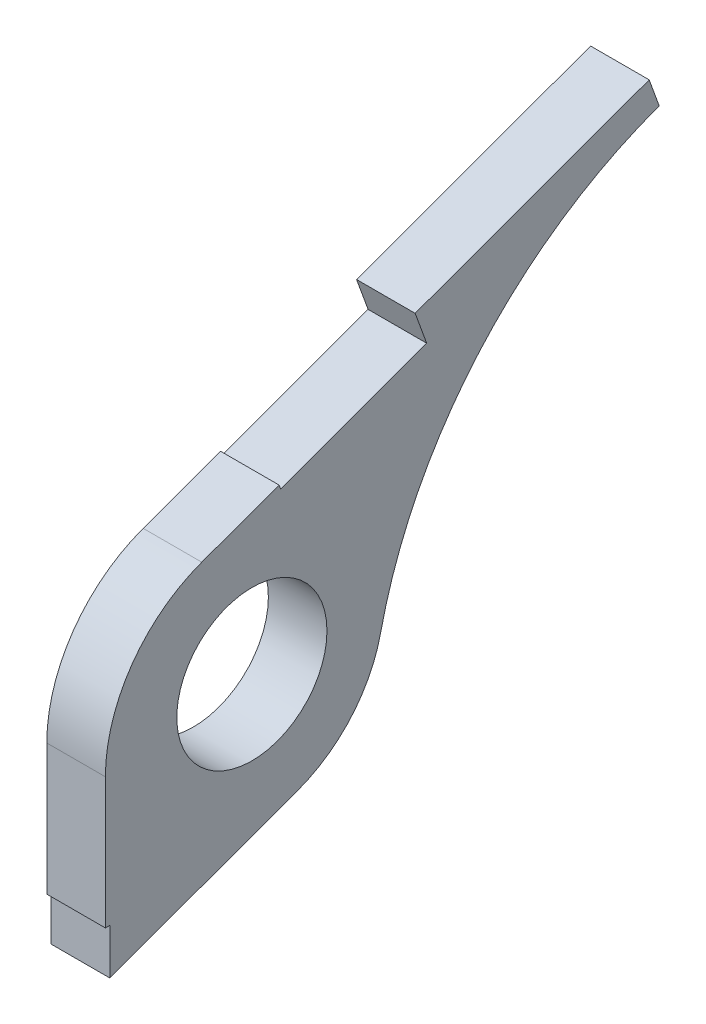
ISO-10303-21;
HEADER;
FILE_DESCRIPTION(('STEP AP214'),'2;1');
FILE_NAME('part.step','',(''),(''),'','','');
FILE_SCHEMA(('AUTOMOTIVE_DESIGN { 1 0 10303 214 1 1 1 1 }'));
ENDSEC;
DATA;
#1=APPLICATION_CONTEXT('core data for automotive mechanical design processes');
#2=APPLICATION_PROTOCOL_DEFINITION('international standard','automotive_design',2000,#1);
#3=PRODUCT_CONTEXT('',#1,'mechanical');
#4=PRODUCT('Part','Part','',(#3));
#5=PRODUCT_RELATED_PRODUCT_CATEGORY('part','',(#4));
#6=PRODUCT_DEFINITION_FORMATION('','',#4);
#7=PRODUCT_DEFINITION_CONTEXT('part definition',#1,'design');
#8=PRODUCT_DEFINITION('design','',#6,#7);
#9=PRODUCT_DEFINITION_SHAPE('','',#8);
#10=(LENGTH_UNIT() NAMED_UNIT(*) SI_UNIT(.MILLI.,.METRE.));
#11=(NAMED_UNIT(*) PLANE_ANGLE_UNIT() SI_UNIT($,.RADIAN.));
#12=(NAMED_UNIT(*) SI_UNIT($,.STERADIAN.) SOLID_ANGLE_UNIT());
#13=UNCERTAINTY_MEASURE_WITH_UNIT(LENGTH_MEASURE(1.E-05),#10,'distance_accuracy_value','');
#14=(GEOMETRIC_REPRESENTATION_CONTEXT(3) GLOBAL_UNCERTAINTY_ASSIGNED_CONTEXT((#13)) GLOBAL_UNIT_ASSIGNED_CONTEXT((#10,
#11,#12)) REPRESENTATION_CONTEXT('',''));
#15=CARTESIAN_POINT('',(0.,0.,0.));
#16=DIRECTION('',(0.,0.,1.));
#17=DIRECTION('',(1.,0.,0.));
#18=AXIS2_PLACEMENT_3D('',#15,#16,#17);
#19=CARTESIAN_POINT('',(240.599999999999,107.401908362402,262.395309409204));
#20=DIRECTION('',(0.,0.342020143325663,-0.939692620785911));
#21=DIRECTION('',(0.,0.939692620785911,0.342020143325663));
#22=AXIS2_PLACEMENT_3D('',#19,#20,#21);
#23=PLANE('',#22);
#24=DIRECTION('',(0.,0.939692620785911,0.342020143325663));
#25=VECTOR('',#24,1.);
#26=CARTESIAN_POINT('',(236.599999999999,107.401908362402,262.395309409204));
#27=LINE('',#26,#25);
#28=CARTESIAN_POINT('',(236.599999999999,107.683816148638,262.497915452201));
#29=VERTEX_POINT('',#28);
#30=CARTESIAN_POINT('',(236.599999999999,109.563201390209,263.181955738853));
#31=VERTEX_POINT('',#30);
#32=EDGE_CURVE('E143',#29,#31,#27,.T.);
#33=ORIENTED_EDGE('',*,*,#32,.T.);
#34=DIRECTION('',(-1.,0.,0.));
#35=VECTOR('',#34,1.);
#36=CARTESIAN_POINT('',(240.599999999999,109.563201390209,263.181955738853));
#37=LINE('',#36,#35);
#38=CARTESIAN_POINT('',(240.599999999999,109.563201390209,263.181955738853));
#39=VERTEX_POINT('',#38);
#40=EDGE_CURVE('E130',#39,#31,#37,.T.);
#41=ORIENTED_EDGE('',*,*,#40,.F.);
#42=DIRECTION('',(0.,0.939692620785911,0.342020143325663));
#43=VECTOR('',#42,1.);
#44=CARTESIAN_POINT('',(240.599999999999,107.401908362402,262.395309409204));
#45=LINE('',#44,#43);
#46=CARTESIAN_POINT('',(240.599999999999,107.683816148638,262.497915452201));
#47=VERTEX_POINT('',#46);
#48=EDGE_CURVE('E140',#47,#39,#45,.T.);
#49=ORIENTED_EDGE('',*,*,#48,.F.);
#50=DIRECTION('',(-1.,0.,0.));
#51=VECTOR('',#50,1.);
#52=CARTESIAN_POINT('',(240.599999999999,107.683816148638,262.497915452201));
#53=LINE('',#52,#51);
#54=EDGE_CURVE('E171',#47,#29,#53,.T.);
#55=ORIENTED_EDGE('',*,*,#54,.T.);
#56=EDGE_LOOP('',(#33,#41,#49,#55));
#57=FACE_BOUND('',#56,.T.);
#58=ADVANCED_FACE('F35',(#57),#23,.T.);
#59=CARTESIAN_POINT('',(240.599999999999,101.587565925866,278.370083962564));
#60=DIRECTION('',(0.,-0.342020143325663,0.939692620785911));
#61=DIRECTION('',(0.,-0.939692620785911,-0.342020143325663));
#62=AXIS2_PLACEMENT_3D('',#59,#60,#61);
#63=PLANE('',#62);
#64=DIRECTION('',(0.,0.939692620785911,0.342020143325663));
#65=VECTOR('',#64,1.);
#66=CARTESIAN_POINT('',(240.599999999999,101.587565925866,278.370083962564));
#67=LINE('',#66,#65);
#68=CARTESIAN_POINT('',(240.599999999999,101.587565925866,278.370083962564));
#69=VERTEX_POINT('',#68);
#70=CARTESIAN_POINT('',(240.599999999999,103.748858953673,279.156730292213));
#71=VERTEX_POINT('',#70);
#72=EDGE_CURVE('E150',#69,#71,#67,.T.);
#73=ORIENTED_EDGE('',*,*,#72,.T.);
#74=DIRECTION('',(1.,0.,0.));
#75=VECTOR('',#74,1.);
#76=CARTESIAN_POINT('',(236.599999999999,103.748858953673,279.156730292213));
#77=LINE('',#76,#75);
#78=CARTESIAN_POINT('',(236.599999999999,103.748858953673,279.156730292213));
#79=VERTEX_POINT('',#78);
#80=EDGE_CURVE('E50',#79,#71,#77,.T.);
#81=ORIENTED_EDGE('',*,*,#80,.F.);
#82=DIRECTION('',(0.,0.939692620785911,0.342020143325663));
#83=VECTOR('',#82,1.);
#84=CARTESIAN_POINT('',(236.599999999999,101.587565925866,278.370083962564));
#85=LINE('',#84,#83);
#86=CARTESIAN_POINT('',(236.599999999999,101.587565925866,278.370083962564));
#87=VERTEX_POINT('',#86);
#88=EDGE_CURVE('E154',#87,#79,#85,.T.);
#89=ORIENTED_EDGE('',*,*,#88,.F.);
#90=DIRECTION('',(1.,0.,0.));
#91=VECTOR('',#90,1.);
#92=CARTESIAN_POINT('',(240.599999999999,101.587565925866,278.370083962564));
#93=LINE('',#92,#91);
#94=EDGE_CURVE('E157',#87,#69,#93,.T.);
#95=ORIENTED_EDGE('',*,*,#94,.T.);
#96=EDGE_LOOP('',(#73,#81,#89,#95));
#97=FACE_BOUND('',#96,.T.);
#98=ADVANCED_FACE('F261',(#97),#63,.T.);
#99=CARTESIAN_POINT('',(236.599999999999,79.4930375250604,252.237311152431));
#100=DIRECTION('',(1.,0.,0.));
#101=DIRECTION('',(0.,0.,-1.));
#102=AXIS2_PLACEMENT_3D('',#99,#100,#101);
#103=PLANE('',#102);
#104=CARTESIAN_POINT('',(236.599999999999,87.9866537043276,290.301184893806));
#105=DIRECTION('',(1.,0.,0.));
#106=DIRECTION('',(0.,0.,-1.));
#107=AXIS2_PLACEMENT_3D('',#104,#105,#106);
#108=CIRCLE('',#107,5.125);
#109=CARTESIAN_POINT('',(236.599999999999,87.9866537043276,285.176184893806));
#110=VERTEX_POINT('',#109);
#111=EDGE_CURVE('E198',#110,#110,#108,.T.);
#112=ORIENTED_EDGE('',*,*,#111,.T.);
#113=EDGE_LOOP('',(#112));
#114=FACE_BOUND('',#113,.T.);
#115=DIRECTION('',(0.,-0.342020143325664,0.93969262078591));
#116=VECTOR('',#115,1.);
#117=CARTESIAN_POINT('',(236.599999999999,109.563201390209,263.181955738853));
#118=LINE('',#117,#116);
#119=EDGE_CURVE('E144',#31,#79,#118,.T.);
#120=ORIENTED_EDGE('',*,*,#119,.F.);
#121=ORIENTED_EDGE('',*,*,#32,.F.);
#122=CARTESIAN_POINT('',(236.599999999999,79.4930375250604,252.237311152431));
#123=DIRECTION('',(-1.,0.,0.));
#124=DIRECTION('',(0.,0.,-1.));
#125=AXIS2_PLACEMENT_3D('',#122,#123,#124);
#126=CIRCLE('',#125,30.);
#127=CARTESIAN_POINT('',(236.599999999999,86.026588432189,281.517214030412));
#128=VERTEX_POINT('',#127);
#129=EDGE_CURVE('E190',#128,#29,#126,.T.);
#130=ORIENTED_EDGE('',*,*,#129,.F.);
#131=CARTESIAN_POINT('',(236.599999999999,87.9866537043276,290.301184893806));
#132=DIRECTION('',(1.,0.,0.));
#133=DIRECTION('',(0.,0.,-1.));
#134=AXIS2_PLACEMENT_3D('',#131,#132,#133);
#135=CIRCLE('',#134,9.);
#136=CARTESIAN_POINT('',(236.599999999999,79.5294201172552,287.223003603873));
#137=VERTEX_POINT('',#136);
#138=EDGE_CURVE('E185',#137,#128,#135,.T.);
#139=ORIENTED_EDGE('',*,*,#138,.F.);
#140=DIRECTION('',(0.,0.342020143325917,-0.939692620785818));
#141=VECTOR('',#140,1.);
#142=CARTESIAN_POINT('',(236.599999999999,74.7693514093784,300.301184893806));
#143=LINE('',#142,#141);
#144=CARTESIAN_POINT('',(236.599999999999,74.8785424796584,300.001184893806));
#145=VERTEX_POINT('',#144);
#146=EDGE_CURVE('E177',#145,#137,#143,.T.);
#147=ORIENTED_EDGE('',*,*,#146,.F.);
#148=DIRECTION('',(0.,-1.,0.));
#149=VECTOR('',#148,1.);
#150=CARTESIAN_POINT('',(236.599999999999,79.4930375250604,300.001184893806));
#151=LINE('',#150,#149);
#152=CARTESIAN_POINT('',(236.599999999999,77.9866537043276,300.001184893806));
#153=VERTEX_POINT('',#152);
#154=EDGE_CURVE('E167',#153,#145,#151,.T.);
#155=ORIENTED_EDGE('',*,*,#154,.F.);
#156=DIRECTION('',(0.,0.,1.));
#157=VECTOR('',#156,1.);
#158=CARTESIAN_POINT('',(236.599999999999,77.9866537043276,252.237311152431));
#159=LINE('',#158,#157);
#160=CARTESIAN_POINT('',(236.599999999999,77.9866537043276,300.301184893806));
#161=VERTEX_POINT('',#160);
#162=EDGE_CURVE('E201',#153,#161,#159,.T.);
#163=ORIENTED_EDGE('',*,*,#162,.T.);
#164=DIRECTION('',(0.,-1.,0.));
#165=VECTOR('',#164,1.);
#166=CARTESIAN_POINT('',(236.599999999999,86.9224759318517,300.301184893806));
#167=LINE('',#166,#165);
#168=CARTESIAN_POINT('',(236.599999999999,86.9224759318517,300.301184893806));
#169=VERTEX_POINT('',#168);
#170=EDGE_CURVE('E173',#169,#161,#167,.T.);
#171=ORIENTED_EDGE('',*,*,#170,.F.);
#172=CARTESIAN_POINT('',(236.599999999999,86.9224759318517,290.301184893806));
#173=DIRECTION('',(1.,0.,0.));
#174=DIRECTION('',(0.,0.,-1.));
#175=AXIS2_PLACEMENT_3D('',#172,#173,#174);
#176=CIRCLE('',#175,10.);
#177=CARTESIAN_POINT('',(236.599999999999,96.3194021397108,293.721386327063));
#178=VERTEX_POINT('',#177);
#179=EDGE_CURVE('E178',#178,#169,#176,.T.);
#180=ORIENTED_EDGE('',*,*,#179,.F.);
#181=DIRECTION('',(0.,-0.342020143325636,0.93969262078592));
#182=VECTOR('',#181,1.);
#183=CARTESIAN_POINT('',(236.599999999999,98.2402356721976,288.443939570023));
#184=LINE('',#183,#182);
#185=CARTESIAN_POINT('',(236.599999999999,98.2402356721976,288.443939570023));
#186=VERTEX_POINT('',#185);
#187=EDGE_CURVE('E189',#186,#178,#184,.T.);
#188=ORIENTED_EDGE('',*,*,#187,.F.);
#189=DIRECTION('',(0.,0.939692620785911,0.342020143325663));
#190=VECTOR('',#189,1.);
#191=CARTESIAN_POINT('',(236.599999999999,70.0494570486204,278.183335270253));
#192=LINE('',#191,#190);
#193=CARTESIAN_POINT('',(236.599999999999,97.9583278859618,288.341333527025));
#194=VERTEX_POINT('',#193);
#195=EDGE_CURVE('E253',#194,#186,#192,.T.);
#196=ORIENTED_EDGE('',*,*,#195,.F.);
#197=DIRECTION('',(0.,-0.342020143325663,0.939692620785911));
#198=VECTOR('',#197,1.);
#199=CARTESIAN_POINT('',(236.599999999999,107.401908362402,262.395309409204));
#200=LINE('',#199,#198);
#201=EDGE_CURVE('E149',#87,#194,#200,.T.);
#202=ORIENTED_EDGE('',*,*,#201,.F.);
#203=ORIENTED_EDGE('',*,*,#88,.T.);
#204=EDGE_LOOP('',(#120,#121,#130,#139,#147,#155,#163,#171,#180,#188,#196,#202,#203));
#205=FACE_BOUND('',#204,.T.);
#206=ADVANCED_FACE('F232',(#114,#205),#103,.F.);
#207=CARTESIAN_POINT('',(240.599999999999,79.4930375250604,252.237311152431));
#208=DIRECTION('',(1.,0.,0.));
#209=DIRECTION('',(0.,0.,-1.));
#210=AXIS2_PLACEMENT_3D('',#207,#208,#209);
#211=PLANE('',#210);
#212=CARTESIAN_POINT('',(240.599999999999,87.9866537043276,290.301184893806));
#213=DIRECTION('',(1.,0.,0.));
#214=DIRECTION('',(0.,0.,-1.));
#215=AXIS2_PLACEMENT_3D('',#212,#213,#214);
#216=CIRCLE('',#215,5.125);
#217=CARTESIAN_POINT('',(240.599999999999,87.9866537043276,285.176184893806));
#218=VERTEX_POINT('',#217);
#219=EDGE_CURVE('E184',#218,#218,#216,.T.);
#220=ORIENTED_EDGE('',*,*,#219,.F.);
#221=EDGE_LOOP('',(#220));
#222=FACE_BOUND('',#221,.T.);
#223=ORIENTED_EDGE('',*,*,#48,.T.);
#224=DIRECTION('',(0.,0.342020143325663,-0.93969262078591));
#225=VECTOR('',#224,1.);
#226=CARTESIAN_POINT('',(240.599999999999,103.748858953673,279.156730292213));
#227=LINE('',#226,#225);
#228=EDGE_CURVE('E127',#71,#39,#227,.T.);
#229=ORIENTED_EDGE('',*,*,#228,.F.);
#230=ORIENTED_EDGE('',*,*,#72,.F.);
#231=DIRECTION('',(0.,-0.342020143325663,0.939692620785911));
#232=VECTOR('',#231,1.);
#233=CARTESIAN_POINT('',(240.599999999999,107.401908362402,262.395309409204));
#234=LINE('',#233,#232);
#235=CARTESIAN_POINT('',(240.599999999999,97.9583278859618,288.341333527025));
#236=VERTEX_POINT('',#235);
#237=EDGE_CURVE('E152',#69,#236,#234,.T.);
#238=ORIENTED_EDGE('',*,*,#237,.T.);
#239=DIRECTION('',(0.,0.939692620785911,0.342020143325663));
#240=VECTOR('',#239,1.);
#241=CARTESIAN_POINT('',(240.599999999999,70.0494570486204,278.183335270253));
#242=LINE('',#241,#240);
#243=CARTESIAN_POINT('',(240.599999999999,98.2402356721976,288.443939570023));
#244=VERTEX_POINT('',#243);
#245=EDGE_CURVE('E256',#236,#244,#242,.T.);
#246=ORIENTED_EDGE('',*,*,#245,.T.);
#247=DIRECTION('',(0.,-0.342020143325668,0.939692620785909));
#248=VECTOR('',#247,1.);
#249=CARTESIAN_POINT('',(240.599999999999,107.683816148638,262.497915452201));
#250=LINE('',#249,#248);
#251=CARTESIAN_POINT('',(240.599999999999,96.3194021397108,293.721386327063));
#252=VERTEX_POINT('',#251);
#253=EDGE_CURVE('E209',#244,#252,#250,.T.);
#254=ORIENTED_EDGE('',*,*,#253,.T.);
#255=CARTESIAN_POINT('',(240.599999999999,86.9224759318517,290.301184893806));
#256=DIRECTION('',(1.,0.,0.));
#257=DIRECTION('',(0.,0.,-1.));
#258=AXIS2_PLACEMENT_3D('',#255,#256,#257);
#259=CIRCLE('',#258,10.);
#260=CARTESIAN_POINT('',(240.599999999999,86.9224759318517,300.301184893806));
#261=VERTEX_POINT('',#260);
#262=EDGE_CURVE('E207',#252,#261,#259,.T.);
#263=ORIENTED_EDGE('',*,*,#262,.T.);
#264=DIRECTION('',(0.,-1.,0.));
#265=VECTOR('',#264,1.);
#266=CARTESIAN_POINT('',(240.599999999999,86.9224759318517,300.301184893806));
#267=LINE('',#266,#265);
#268=CARTESIAN_POINT('',(240.599999999999,77.9866537043276,300.301184893806));
#269=VERTEX_POINT('',#268);
#270=EDGE_CURVE('E204',#261,#269,#267,.T.);
#271=ORIENTED_EDGE('',*,*,#270,.T.);
#272=DIRECTION('',(0.,0.,1.));
#273=VECTOR('',#272,1.);
#274=CARTESIAN_POINT('',(240.599999999999,77.9866537043276,252.237311152431));
#275=LINE('',#274,#273);
#276=CARTESIAN_POINT('',(240.599999999999,77.9866537043276,300.001184893806));
#277=VERTEX_POINT('',#276);
#278=EDGE_CURVE('E43',#277,#269,#275,.T.);
#279=ORIENTED_EDGE('',*,*,#278,.F.);
#280=DIRECTION('',(0.,1.,0.));
#281=VECTOR('',#280,1.);
#282=CARTESIAN_POINT('',(240.599999999999,79.4930375250604,300.001184893806));
#283=LINE('',#282,#281);
#284=CARTESIAN_POINT('',(240.599999999999,74.8785424796584,300.001184893806));
#285=VERTEX_POINT('',#284);
#286=EDGE_CURVE('E11',#285,#277,#283,.T.);
#287=ORIENTED_EDGE('',*,*,#286,.F.);
#288=DIRECTION('',(0.,0.342020143325917,-0.939692620785818));
#289=VECTOR('',#288,1.);
#290=CARTESIAN_POINT('',(240.599999999999,74.7693514093784,300.301184893806));
#291=LINE('',#290,#289);
#292=CARTESIAN_POINT('',(240.599999999999,79.5294201172552,287.223003603873));
#293=VERTEX_POINT('',#292);
#294=EDGE_CURVE('E202',#285,#293,#291,.T.);
#295=ORIENTED_EDGE('',*,*,#294,.T.);
#296=CARTESIAN_POINT('',(240.599999999999,87.9866537043276,290.301184893806));
#297=DIRECTION('',(1.,0.,0.));
#298=DIRECTION('',(0.,0.,-1.));
#299=AXIS2_PLACEMENT_3D('',#296,#297,#298);
#300=CIRCLE('',#299,9.);
#301=CARTESIAN_POINT('',(240.599999999999,86.026588432189,281.517214030412));
#302=VERTEX_POINT('',#301);
#303=EDGE_CURVE('E199',#293,#302,#300,.T.);
#304=ORIENTED_EDGE('',*,*,#303,.T.);
#305=CARTESIAN_POINT('',(240.599999999999,79.4930375250604,252.237311152431));
#306=DIRECTION('',(-1.,0.,0.));
#307=DIRECTION('',(0.,0.,-1.));
#308=AXIS2_PLACEMENT_3D('',#305,#306,#307);
#309=CIRCLE('',#308,30.);
#310=EDGE_CURVE('E148',#302,#47,#309,.T.);
#311=ORIENTED_EDGE('',*,*,#310,.T.);
#312=EDGE_LOOP('',(#223,#229,#230,#238,#246,#254,#263,#271,#279,#287,#295,#304,#311));
#313=FACE_BOUND('',#312,.T.);
#314=ADVANCED_FACE('F146',(#222,#313),#211,.T.);
#315=CARTESIAN_POINT('',(240.599999999999,86.9224759318517,300.301184893806));
#316=DIRECTION('',(0.,0.,-1.));
#317=DIRECTION('',(-1.,0.,0.));
#318=AXIS2_PLACEMENT_3D('',#315,#316,#317);
#319=PLANE('',#318);
#320=DIRECTION('',(-1.,0.,0.));
#321=VECTOR('',#320,1.);
#322=CARTESIAN_POINT('',(191.3,77.9866537043276,300.301184893806));
#323=LINE('',#322,#321);
#324=EDGE_CURVE('E170',#269,#161,#323,.T.);
#325=ORIENTED_EDGE('',*,*,#324,.F.);
#326=ORIENTED_EDGE('',*,*,#270,.F.);
#327=DIRECTION('',(-1.,0.,0.));
#328=VECTOR('',#327,1.);
#329=CARTESIAN_POINT('',(240.599999999999,86.9224759318517,300.301184893806));
#330=LINE('',#329,#328);
#331=EDGE_CURVE('E164',#261,#169,#330,.T.);
#332=ORIENTED_EDGE('',*,*,#331,.T.);
#333=ORIENTED_EDGE('',*,*,#170,.T.);
#334=EDGE_LOOP('',(#325,#326,#332,#333));
#335=FACE_BOUND('',#334,.T.);
#336=ADVANCED_FACE('F227',(#335),#319,.F.);
#337=CARTESIAN_POINT('',(238.599999999999,77.9866537043276,300.001184893806));
#338=DIRECTION('',(0.,1.,0.));
#339=DIRECTION('',(0.,0.,1.));
#340=AXIS2_PLACEMENT_3D('',#337,#338,#339);
#341=PLANE('',#340);
#342=DIRECTION('',(-1.,0.,0.));
#343=VECTOR('',#342,1.);
#344=CARTESIAN_POINT('',(238.599999999999,77.9866537043276,300.001184893806));
#345=LINE('',#344,#343);
#346=EDGE_CURVE('E58',#277,#153,#345,.T.);
#347=ORIENTED_EDGE('',*,*,#346,.F.);
#348=ORIENTED_EDGE('',*,*,#278,.T.);
#349=ORIENTED_EDGE('',*,*,#324,.T.);
#350=ORIENTED_EDGE('',*,*,#162,.F.);
#351=EDGE_LOOP('',(#347,#348,#349,#350));
#352=FACE_BOUND('',#351,.T.);
#353=ADVANCED_FACE('F221',(#352),#341,.F.);
#354=CARTESIAN_POINT('',(0.,0.,300.001184893806));
#355=DIRECTION('',(0.,0.,1.));
#356=DIRECTION('',(1.,0.,0.));
#357=AXIS2_PLACEMENT_3D('',#354,#355,#356);
#358=PLANE('',#357);
#359=ORIENTED_EDGE('',*,*,#154,.T.);
#360=DIRECTION('',(1.,0.,0.));
#361=VECTOR('',#360,1.);
#362=CARTESIAN_POINT('',(240.599999999999,74.8785424796584,300.001184893806));
#363=LINE('',#362,#361);
#364=EDGE_CURVE('E165',#145,#285,#363,.T.);
#365=ORIENTED_EDGE('',*,*,#364,.T.);
#366=ORIENTED_EDGE('',*,*,#286,.T.);
#367=ORIENTED_EDGE('',*,*,#346,.T.);
#368=EDGE_LOOP('',(#359,#365,#366,#367));
#369=FACE_BOUND('',#368,.T.);
#370=ADVANCED_FACE('F37',(#369),#358,.T.);
#371=CARTESIAN_POINT('',(240.599999999999,74.7693514093784,300.301184893806));
#372=DIRECTION('',(0.,0.939692620785818,0.342020143325917));
#373=DIRECTION('',(0.,-0.342020143325917,0.939692620785818));
#374=AXIS2_PLACEMENT_3D('',#371,#372,#373);
#375=PLANE('',#374);
#376=ORIENTED_EDGE('',*,*,#294,.F.);
#377=ORIENTED_EDGE('',*,*,#364,.F.);
#378=ORIENTED_EDGE('',*,*,#146,.T.);
#379=DIRECTION('',(-1.,0.,0.));
#380=VECTOR('',#379,1.);
#381=CARTESIAN_POINT('',(240.599999999999,79.5294201172552,287.223003603873));
#382=LINE('',#381,#380);
#383=EDGE_CURVE('E181',#293,#137,#382,.T.);
#384=ORIENTED_EDGE('',*,*,#383,.F.);
#385=EDGE_LOOP('',(#376,#377,#378,#384));
#386=FACE_BOUND('',#385,.T.);
#387=ADVANCED_FACE('F239',(#386),#375,.F.);
#388=CARTESIAN_POINT('',(240.599999999999,87.9866537043276,290.301184893806));
#389=DIRECTION('',(-1.,0.,0.));
#390=DIRECTION('',(0.,0.,1.));
#391=AXIS2_PLACEMENT_3D('',#388,#389,#390);
#392=CYLINDRICAL_SURFACE('',#391,9.);
#393=ORIENTED_EDGE('',*,*,#138,.T.);
#394=DIRECTION('',(-1.,0.,0.));
#395=VECTOR('',#394,1.);
#396=CARTESIAN_POINT('',(240.599999999999,86.026588432189,281.517214030412));
#397=LINE('',#396,#395);
#398=EDGE_CURVE('E186',#302,#128,#397,.T.);
#399=ORIENTED_EDGE('',*,*,#398,.F.);
#400=ORIENTED_EDGE('',*,*,#303,.F.);
#401=ORIENTED_EDGE('',*,*,#383,.T.);
#402=EDGE_LOOP('',(#393,#399,#400,#401));
#403=FACE_BOUND('',#402,.T.);
#404=ADVANCED_FACE('F244',(#403),#392,.T.);
#405=CARTESIAN_POINT('',(240.599999999999,79.4930375250604,252.237311152431));
#406=DIRECTION('',(-1.,0.,0.));
#407=DIRECTION('',(0.,0.,1.));
#408=AXIS2_PLACEMENT_3D('',#405,#406,#407);
#409=CYLINDRICAL_SURFACE('',#408,30.);
#410=ORIENTED_EDGE('',*,*,#129,.T.);
#411=ORIENTED_EDGE('',*,*,#54,.F.);
#412=ORIENTED_EDGE('',*,*,#310,.F.);
#413=ORIENTED_EDGE('',*,*,#398,.T.);
#414=EDGE_LOOP('',(#410,#411,#412,#413));
#415=FACE_BOUND('',#414,.T.);
#416=ADVANCED_FACE('F247',(#415),#409,.F.);
#417=CARTESIAN_POINT('',(240.599999999999,87.9866537043276,290.301184893806));
#418=DIRECTION('',(-1.,0.,0.));
#419=DIRECTION('',(0.,0.,1.));
#420=AXIS2_PLACEMENT_3D('',#417,#418,#419);
#421=CYLINDRICAL_SURFACE('',#420,5.125);
#422=ORIENTED_EDGE('',*,*,#219,.T.);
#423=EDGE_LOOP('',(#422));
#424=FACE_BOUND('',#423,.T.);
#425=ORIENTED_EDGE('',*,*,#111,.F.);
#426=EDGE_LOOP('',(#425));
#427=FACE_BOUND('',#426,.T.);
#428=ADVANCED_FACE('F278',(#424,#427),#421,.F.);
#429=CARTESIAN_POINT('',(240.599999999999,86.9224759318517,290.301184893806));
#430=DIRECTION('',(-1.,0.,0.));
#431=DIRECTION('',(0.,0.,1.));
#432=AXIS2_PLACEMENT_3D('',#429,#430,#431);
#433=CYLINDRICAL_SURFACE('',#432,10.);
#434=ORIENTED_EDGE('',*,*,#179,.T.);
#435=ORIENTED_EDGE('',*,*,#331,.F.);
#436=ORIENTED_EDGE('',*,*,#262,.F.);
#437=DIRECTION('',(-1.,0.,0.));
#438=VECTOR('',#437,1.);
#439=CARTESIAN_POINT('',(240.599999999999,96.3194021397108,293.721386327063));
#440=LINE('',#439,#438);
#441=EDGE_CURVE('E174',#252,#178,#440,.T.);
#442=ORIENTED_EDGE('',*,*,#441,.T.);
#443=EDGE_LOOP('',(#434,#435,#436,#442));
#444=FACE_BOUND('',#443,.T.);
#445=ADVANCED_FACE('F276',(#444),#433,.T.);
#446=CARTESIAN_POINT('',(240.599999999999,98.2402356721976,288.443939570023));
#447=DIRECTION('',(0.,-0.93969262078592,-0.342020143325636));
#448=DIRECTION('',(0.,0.342020143325636,-0.93969262078592));
#449=AXIS2_PLACEMENT_3D('',#446,#447,#448);
#450=PLANE('',#449);
#451=DIRECTION('',(1.,0.,0.));
#452=VECTOR('',#451,1.);
#453=CARTESIAN_POINT('',(253.5,98.2402356721976,288.443939570023));
#454=LINE('',#453,#452);
#455=EDGE_CURVE('E168',#186,#244,#454,.T.);
#456=ORIENTED_EDGE('',*,*,#455,.F.);
#457=ORIENTED_EDGE('',*,*,#187,.T.);
#458=ORIENTED_EDGE('',*,*,#441,.F.);
#459=ORIENTED_EDGE('',*,*,#253,.F.);
#460=EDGE_LOOP('',(#456,#457,#458,#459));
#461=FACE_BOUND('',#460,.T.);
#462=ADVANCED_FACE('F274',(#461),#450,.F.);
#463=CARTESIAN_POINT('',(0.,179.170498585947,65.2127283439182));
#464=DIRECTION('',(0.,0.939692620785911,0.342020143325663));
#465=DIRECTION('',(0.,-0.342020143325663,0.939692620785911));
#466=AXIS2_PLACEMENT_3D('',#463,#464,#465);
#467=PLANE('',#466);
#468=ORIENTED_EDGE('',*,*,#94,.F.);
#469=ORIENTED_EDGE('',*,*,#201,.T.);
#470=DIRECTION('',(-1.,0.,0.));
#471=VECTOR('',#470,1.);
#472=CARTESIAN_POINT('',(240.976349916508,97.9583278859618,288.341333527025));
#473=LINE('',#472,#471);
#474=EDGE_CURVE('E250',#236,#194,#473,.T.);
#475=ORIENTED_EDGE('',*,*,#474,.F.);
#476=ORIENTED_EDGE('',*,*,#237,.F.);
#477=EDGE_LOOP('',(#468,#469,#475,#476));
#478=FACE_BOUND('',#477,.T.);
#479=ADVANCED_FACE('F264',(#478),#467,.T.);
#480=CARTESIAN_POINT('',(240.976349916508,97.9583278859618,288.341333527025));
#481=DIRECTION('',(0.,0.342020143325663,-0.93969262078591));
#482=DIRECTION('',(0.,0.939692620785911,0.342020143325663));
#483=AXIS2_PLACEMENT_3D('',#480,#481,#482);
#484=PLANE('',#483);
#485=ORIENTED_EDGE('',*,*,#474,.T.);
#486=ORIENTED_EDGE('',*,*,#195,.T.);
#487=ORIENTED_EDGE('',*,*,#455,.T.);
#488=ORIENTED_EDGE('',*,*,#245,.F.);
#489=EDGE_LOOP('',(#485,#486,#487,#488));
#490=FACE_BOUND('',#489,.T.);
#491=ADVANCED_FACE('F267',(#490),#484,.T.);
#492=CARTESIAN_POINT('',(0.,181.331791613754,65.9993746735672));
#493=DIRECTION('',(0.,0.939692620785911,0.342020143325663));
#494=DIRECTION('',(0.,-0.342020143325663,0.939692620785911));
#495=AXIS2_PLACEMENT_3D('',#492,#493,#494);
#496=PLANE('',#495);
#497=ORIENTED_EDGE('',*,*,#80,.T.);
#498=ORIENTED_EDGE('',*,*,#228,.T.);
#499=ORIENTED_EDGE('',*,*,#40,.T.);
#500=ORIENTED_EDGE('',*,*,#119,.T.);
#501=EDGE_LOOP('',(#497,#498,#499,#500));
#502=FACE_BOUND('',#501,.T.);
#503=ADVANCED_FACE('F129',(#502),#496,.T.);
#504=CLOSED_SHELL('',(#58,#98,#206,#314,#336,#353,#370,#387,#404,#416,#428,#445,#462,#479,#491,#503));
#505=MANIFOLD_SOLID_BREP('B2',#504);
#506=ADVANCED_BREP_SHAPE_REPRESENTATION('',(#18,#505),#14);
#507=SHAPE_DEFINITION_REPRESENTATION(#9,#506);
ENDSEC;
END-ISO-10303-21;
